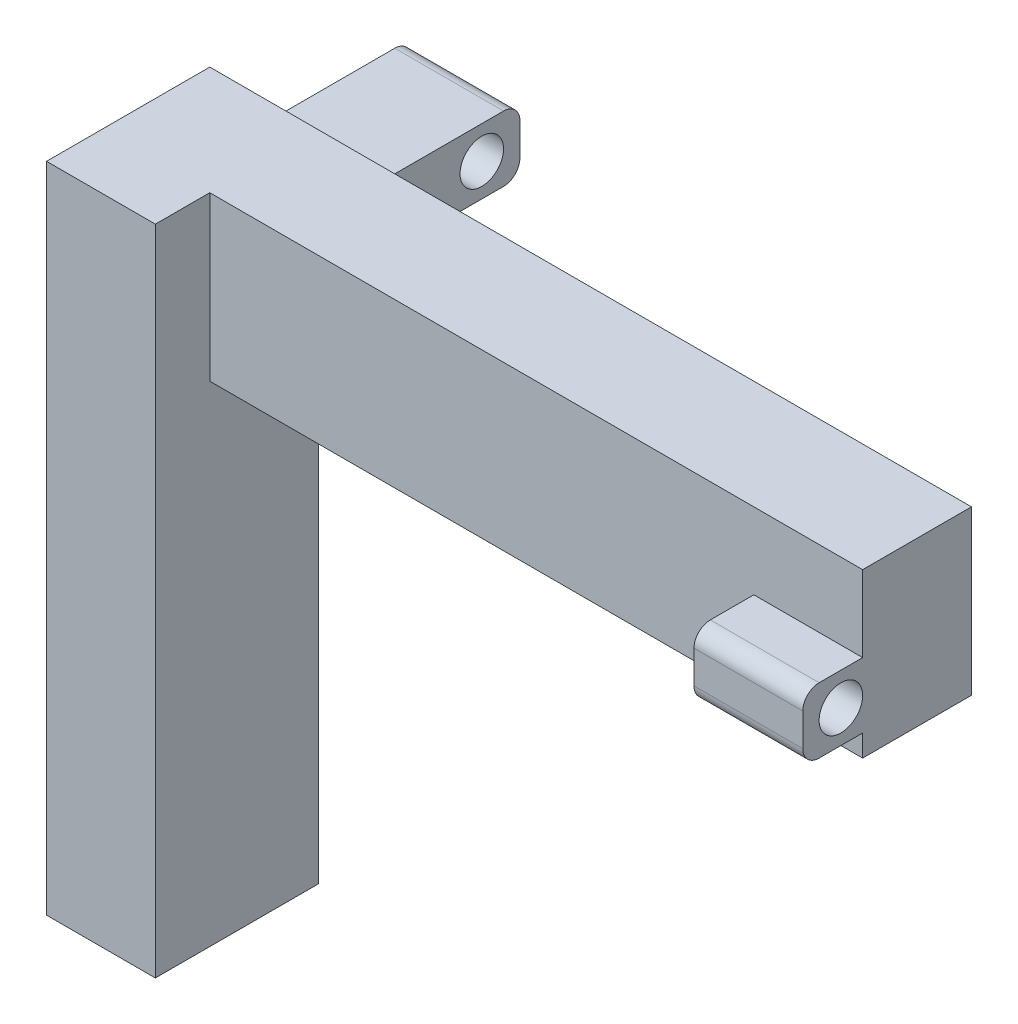
ISO-10303-21;
HEADER;
FILE_DESCRIPTION(('STEP AP214'),'2;1');
FILE_NAME('part.step','',(''),(''),'','','');
FILE_SCHEMA(('AUTOMOTIVE_DESIGN { 1 0 10303 214 1 1 1 1 }'));
ENDSEC;
DATA;
#1=APPLICATION_CONTEXT('core data for automotive mechanical design processes');
#2=APPLICATION_PROTOCOL_DEFINITION('international standard','automotive_design',2000,#1);
#3=PRODUCT_CONTEXT('',#1,'mechanical');
#4=PRODUCT('Part','Part','',(#3));
#5=PRODUCT_RELATED_PRODUCT_CATEGORY('part','',(#4));
#6=PRODUCT_DEFINITION_FORMATION('','',#4);
#7=PRODUCT_DEFINITION_CONTEXT('part definition',#1,'design');
#8=PRODUCT_DEFINITION('design','',#6,#7);
#9=PRODUCT_DEFINITION_SHAPE('','',#8);
#10=(LENGTH_UNIT() NAMED_UNIT(*) SI_UNIT(.MILLI.,.METRE.));
#11=(NAMED_UNIT(*) PLANE_ANGLE_UNIT() SI_UNIT($,.RADIAN.));
#12=(NAMED_UNIT(*) SI_UNIT($,.STERADIAN.) SOLID_ANGLE_UNIT());
#13=UNCERTAINTY_MEASURE_WITH_UNIT(LENGTH_MEASURE(1.E-05),#10,'distance_accuracy_value','');
#14=(GEOMETRIC_REPRESENTATION_CONTEXT(3) GLOBAL_UNCERTAINTY_ASSIGNED_CONTEXT((#13)) GLOBAL_UNIT_ASSIGNED_CONTEXT((#10,
#11,#12)) REPRESENTATION_CONTEXT('',''));
#15=CARTESIAN_POINT('',(0.,0.,0.));
#16=DIRECTION('',(0.,0.,1.));
#17=DIRECTION('',(1.,0.,0.));
#18=AXIS2_PLACEMENT_3D('',#15,#16,#17);
#19=CARTESIAN_POINT('',(0.,0.,0.));
#20=DIRECTION('',(0.,0.,1.));
#21=DIRECTION('',(1.,0.,0.));
#22=AXIS2_PLACEMENT_3D('',#19,#20,#21);
#23=PLANE('',#22);
#24=DIRECTION('',(-1.,0.,0.));
#25=VECTOR('',#24,1.);
#26=CARTESIAN_POINT('',(5.,17.,0.));
#27=LINE('',#26,#25);
#28=CARTESIAN_POINT('',(5.,17.,0.));
#29=VERTEX_POINT('',#28);
#30=CARTESIAN_POINT('',(-5.,17.,0.));
#31=VERTEX_POINT('',#30);
#32=EDGE_CURVE('E211',#29,#31,#27,.T.);
#33=ORIENTED_EDGE('',*,*,#32,.F.);
#34=DIRECTION('',(0.,-1.,0.));
#35=VECTOR('',#34,1.);
#36=CARTESIAN_POINT('',(5.,0.,0.));
#37=LINE('',#36,#35);
#38=CARTESIAN_POINT('',(5.,23.,0.));
#39=VERTEX_POINT('',#38);
#40=EDGE_CURVE('E198',#39,#29,#37,.T.);
#41=ORIENTED_EDGE('',*,*,#40,.F.);
#42=DIRECTION('',(-1.,0.,0.));
#43=VECTOR('',#42,1.);
#44=CARTESIAN_POINT('',(5.,23.,0.));
#45=LINE('',#44,#43);
#46=CARTESIAN_POINT('',(-5.,23.,0.));
#47=VERTEX_POINT('',#46);
#48=EDGE_CURVE('E226',#39,#47,#45,.T.);
#49=ORIENTED_EDGE('',*,*,#48,.T.);
#50=DIRECTION('',(0.,-1.,0.));
#51=VECTOR('',#50,1.);
#52=CARTESIAN_POINT('',(-5.,30.,0.));
#53=LINE('',#52,#51);
#54=CARTESIAN_POINT('',(-5.,30.,0.));
#55=VERTEX_POINT('',#54);
#56=EDGE_CURVE('E323',#55,#47,#53,.T.);
#57=ORIENTED_EDGE('',*,*,#56,.F.);
#58=DIRECTION('',(-1.,0.,0.));
#59=VECTOR('',#58,1.);
#60=CARTESIAN_POINT('',(-5.,30.,0.));
#61=LINE('',#60,#59);
#62=CARTESIAN_POINT('',(65.,30.,0.));
#63=VERTEX_POINT('',#62);
#64=EDGE_CURVE('E320',#63,#55,#61,.T.);
#65=ORIENTED_EDGE('',*,*,#64,.F.);
#66=DIRECTION('',(0.,1.,0.));
#67=VECTOR('',#66,1.);
#68=CARTESIAN_POINT('',(65.,30.,0.));
#69=LINE('',#68,#67);
#70=CARTESIAN_POINT('',(65.,15.,0.));
#71=VERTEX_POINT('',#70);
#72=EDGE_CURVE('E282',#71,#63,#69,.T.);
#73=ORIENTED_EDGE('',*,*,#72,.F.);
#74=DIRECTION('',(-1.,0.,0.));
#75=VECTOR('',#74,1.);
#76=CARTESIAN_POINT('',(65.,15.,0.));
#77=LINE('',#76,#75);
#78=CARTESIAN_POINT('',(5.,15.,0.));
#79=VERTEX_POINT('',#78);
#80=EDGE_CURVE('E294',#71,#79,#77,.T.);
#81=ORIENTED_EDGE('',*,*,#80,.T.);
#82=DIRECTION('',(0.,1.,0.));
#83=VECTOR('',#82,1.);
#84=CARTESIAN_POINT('',(5.,30.,0.));
#85=LINE('',#84,#83);
#86=CARTESIAN_POINT('',(5.00000000000001,-30.,0.));
#87=VERTEX_POINT('',#86);
#88=EDGE_CURVE('E307',#87,#79,#85,.T.);
#89=ORIENTED_EDGE('',*,*,#88,.F.);
#90=DIRECTION('',(1.,0.,0.));
#91=VECTOR('',#90,1.);
#92=CARTESIAN_POINT('',(-4.99999999999999,-30.,0.));
#93=LINE('',#92,#91);
#94=CARTESIAN_POINT('',(-4.99999999999999,-30.,0.));
#95=VERTEX_POINT('',#94);
#96=EDGE_CURVE('E312',#95,#87,#93,.T.);
#97=ORIENTED_EDGE('',*,*,#96,.F.);
#98=EDGE_CURVE('E322',#31,#95,#53,.T.);
#99=ORIENTED_EDGE('',*,*,#98,.F.);
#100=EDGE_LOOP('',(#33,#41,#49,#57,#65,#73,#81,#89,#97,#99));
#101=FACE_BOUND('',#100,.T.);
#102=ADVANCED_FACE('F40',(#101),#23,.F.);
#103=CARTESIAN_POINT('',(65.,30.,10.));
#104=DIRECTION('',(0.,0.,-1.));
#105=DIRECTION('',(-1.,0.,0.));
#106=AXIS2_PLACEMENT_3D('',#103,#104,#105);
#107=PLANE('',#106);
#108=DIRECTION('',(1.,0.,0.));
#109=VECTOR('',#108,1.);
#110=CARTESIAN_POINT('',(55.,23.,10.));
#111=LINE('',#110,#109);
#112=CARTESIAN_POINT('',(55.,23.,10.));
#113=VERTEX_POINT('',#112);
#114=CARTESIAN_POINT('',(65.,23.,10.));
#115=VERTEX_POINT('',#114);
#116=EDGE_CURVE('E275',#113,#115,#111,.T.);
#117=ORIENTED_EDGE('',*,*,#116,.T.);
#118=DIRECTION('',(0.,-1.,0.));
#119=VECTOR('',#118,1.);
#120=CARTESIAN_POINT('',(65.,30.,10.));
#121=LINE('',#120,#119);
#122=CARTESIAN_POINT('',(65.,30.,10.));
#123=VERTEX_POINT('',#122);
#124=EDGE_CURVE('E289',#123,#115,#121,.T.);
#125=ORIENTED_EDGE('',*,*,#124,.F.);
#126=DIRECTION('',(-1.,0.,0.));
#127=VECTOR('',#126,1.);
#128=CARTESIAN_POINT('',(65.,30.,10.));
#129=LINE('',#128,#127);
#130=CARTESIAN_POINT('',(5.,30.,10.));
#131=VERTEX_POINT('',#130);
#132=EDGE_CURVE('E304',#123,#131,#129,.T.);
#133=ORIENTED_EDGE('',*,*,#132,.T.);
#134=DIRECTION('',(0.,-1.,0.));
#135=VECTOR('',#134,1.);
#136=CARTESIAN_POINT('',(5.,30.,10.));
#137=LINE('',#136,#135);
#138=CARTESIAN_POINT('',(5.,15.,10.));
#139=VERTEX_POINT('',#138);
#140=EDGE_CURVE('E270',#131,#139,#137,.T.);
#141=ORIENTED_EDGE('',*,*,#140,.T.);
#142=DIRECTION('',(-1.,0.,0.));
#143=VECTOR('',#142,1.);
#144=CARTESIAN_POINT('',(65.,15.,10.));
#145=LINE('',#144,#143);
#146=CARTESIAN_POINT('',(65.,15.,10.));
#147=VERTEX_POINT('',#146);
#148=EDGE_CURVE('E301',#147,#139,#145,.T.);
#149=ORIENTED_EDGE('',*,*,#148,.F.);
#150=CARTESIAN_POINT('',(65.,17.,10.));
#151=VERTEX_POINT('',#150);
#152=EDGE_CURVE('E288',#151,#147,#121,.T.);
#153=ORIENTED_EDGE('',*,*,#152,.F.);
#154=DIRECTION('',(1.,0.,0.));
#155=VECTOR('',#154,1.);
#156=CARTESIAN_POINT('',(55.,17.,10.));
#157=LINE('',#156,#155);
#158=CARTESIAN_POINT('',(55.,17.,10.));
#159=VERTEX_POINT('',#158);
#160=EDGE_CURVE('E278',#159,#151,#157,.T.);
#161=ORIENTED_EDGE('',*,*,#160,.F.);
#162=DIRECTION('',(0.,1.,0.));
#163=VECTOR('',#162,1.);
#164=CARTESIAN_POINT('',(55.,0.,10.));
#165=LINE('',#164,#163);
#166=CARTESIAN_POINT('',(55.,20.,10.));
#167=VERTEX_POINT('',#166);
#168=EDGE_CURVE('E244',#159,#167,#165,.T.);
#169=ORIENTED_EDGE('',*,*,#168,.T.);
#170=EDGE_CURVE('E243',#167,#113,#165,.T.);
#171=ORIENTED_EDGE('',*,*,#170,.T.);
#172=EDGE_LOOP('',(#117,#125,#133,#141,#149,#153,#161,#169,#171));
#173=FACE_BOUND('',#172,.T.);
#174=ADVANCED_FACE('F361',(#173),#107,.F.);
#175=CARTESIAN_POINT('',(5.,30.,15.));
#176=DIRECTION('',(-1.,0.,0.));
#177=DIRECTION('',(0.,-1.,0.));
#178=AXIS2_PLACEMENT_3D('',#175,#176,#177);
#179=PLANE('',#178);
#180=DIRECTION('',(0.,0.,-1.));
#181=VECTOR('',#180,1.);
#182=CARTESIAN_POINT('',(5.,15.,10.));
#183=LINE('',#182,#181);
#184=EDGE_CURVE('E286',#139,#79,#183,.T.);
#185=ORIENTED_EDGE('',*,*,#184,.F.);
#186=ORIENTED_EDGE('',*,*,#140,.F.);
#187=DIRECTION('',(0.,0.,-1.));
#188=VECTOR('',#187,1.);
#189=CARTESIAN_POINT('',(5.,30.,15.));
#190=LINE('',#189,#188);
#191=CARTESIAN_POINT('',(5.,30.,15.));
#192=VERTEX_POINT('',#191);
#193=EDGE_CURVE('E11',#192,#131,#190,.T.);
#194=ORIENTED_EDGE('',*,*,#193,.F.);
#195=DIRECTION('',(0.,1.,0.));
#196=VECTOR('',#195,1.);
#197=CARTESIAN_POINT('',(5.,30.,15.));
#198=LINE('',#197,#196);
#199=CARTESIAN_POINT('',(5.00000000000001,-30.,15.));
#200=VERTEX_POINT('',#199);
#201=EDGE_CURVE('E308',#200,#192,#198,.T.);
#202=ORIENTED_EDGE('',*,*,#201,.F.);
#203=DIRECTION('',(0.,0.,-1.));
#204=VECTOR('',#203,1.);
#205=CARTESIAN_POINT('',(5.00000000000001,-30.,15.));
#206=LINE('',#205,#204);
#207=EDGE_CURVE('E318',#200,#87,#206,.T.);
#208=ORIENTED_EDGE('',*,*,#207,.T.);
#209=ORIENTED_EDGE('',*,*,#88,.T.);
#210=EDGE_LOOP('',(#185,#186,#194,#202,#208,#209));
#211=FACE_BOUND('',#210,.T.);
#212=ADVANCED_FACE('F42',(#211),#179,.F.);
#213=CARTESIAN_POINT('',(-5.,30.,15.));
#214=DIRECTION('',(0.,-1.,0.));
#215=DIRECTION('',(0.,0.,-1.));
#216=AXIS2_PLACEMENT_3D('',#213,#214,#215);
#217=PLANE('',#216);
#218=ORIENTED_EDGE('',*,*,#64,.T.);
#219=DIRECTION('',(0.,0.,-1.));
#220=VECTOR('',#219,1.);
#221=CARTESIAN_POINT('',(-5.,30.,15.));
#222=LINE('',#221,#220);
#223=CARTESIAN_POINT('',(-5.,30.,15.));
#224=VERTEX_POINT('',#223);
#225=EDGE_CURVE('E48',#224,#55,#222,.T.);
#226=ORIENTED_EDGE('',*,*,#225,.F.);
#227=DIRECTION('',(-1.,0.,0.));
#228=VECTOR('',#227,1.);
#229=CARTESIAN_POINT('',(-5.,30.,15.));
#230=LINE('',#229,#228);
#231=EDGE_CURVE('E311',#192,#224,#230,.T.);
#232=ORIENTED_EDGE('',*,*,#231,.F.);
#233=ORIENTED_EDGE('',*,*,#193,.T.);
#234=ORIENTED_EDGE('',*,*,#132,.F.);
#235=DIRECTION('',(0.,0.,1.));
#236=VECTOR('',#235,1.);
#237=CARTESIAN_POINT('',(65.,30.,0.));
#238=LINE('',#237,#236);
#239=EDGE_CURVE('E285',#63,#123,#238,.T.);
#240=ORIENTED_EDGE('',*,*,#239,.F.);
#241=EDGE_LOOP('',(#218,#226,#232,#233,#234,#240));
#242=FACE_BOUND('',#241,.T.);
#243=ADVANCED_FACE('F376',(#242),#217,.F.);
#244=CARTESIAN_POINT('',(-5.,30.,15.));
#245=DIRECTION('',(1.,0.,0.));
#246=DIRECTION('',(0.,1.,0.));
#247=AXIS2_PLACEMENT_3D('',#244,#245,#246);
#248=PLANE('',#247);
#249=ORIENTED_EDGE('',*,*,#56,.T.);
#250=DIRECTION('',(0.,0.,1.));
#251=VECTOR('',#250,1.);
#252=CARTESIAN_POINT('',(-5.,23.,0.));
#253=LINE('',#252,#251);
#254=CARTESIAN_POINT('',(-5.,23.,-17.));
#255=VERTEX_POINT('',#254);
#256=EDGE_CURVE('E55',#255,#47,#253,.T.);
#257=ORIENTED_EDGE('',*,*,#256,.F.);
#258=CARTESIAN_POINT('',(-5.,21.5,-17.));
#259=DIRECTION('',(1.,0.,0.));
#260=DIRECTION('',(0.,0.,-1.));
#261=AXIS2_PLACEMENT_3D('',#258,#259,#260);
#262=CIRCLE('',#261,1.5);
#263=CARTESIAN_POINT('',(-5.,21.5,-18.5));
#264=VERTEX_POINT('',#263);
#265=EDGE_CURVE('E221',#255,#264,#262,.F.);
#266=ORIENTED_EDGE('',*,*,#265,.T.);
#267=DIRECTION('',(0.,1.,0.));
#268=VECTOR('',#267,1.);
#269=CARTESIAN_POINT('',(-5.,0.,-18.5));
#270=LINE('',#269,#268);
#271=CARTESIAN_POINT('',(-5.,18.5,-18.5));
#272=VERTEX_POINT('',#271);
#273=EDGE_CURVE('E218',#272,#264,#270,.T.);
#274=ORIENTED_EDGE('',*,*,#273,.F.);
#275=CARTESIAN_POINT('',(-5.,18.5,-17.));
#276=DIRECTION('',(1.,0.,0.));
#277=DIRECTION('',(0.,0.,-1.));
#278=AXIS2_PLACEMENT_3D('',#275,#276,#277);
#279=CIRCLE('',#278,1.5);
#280=CARTESIAN_POINT('',(-5.,17.,-17.));
#281=VERTEX_POINT('',#280);
#282=EDGE_CURVE('E216',#281,#272,#279,.T.);
#283=ORIENTED_EDGE('',*,*,#282,.F.);
#284=DIRECTION('',(0.,0.,1.));
#285=VECTOR('',#284,1.);
#286=CARTESIAN_POINT('',(-5.,17.,0.));
#287=LINE('',#286,#285);
#288=EDGE_CURVE('E181',#281,#31,#287,.T.);
#289=ORIENTED_EDGE('',*,*,#288,.T.);
#290=ORIENTED_EDGE('',*,*,#98,.T.);
#291=DIRECTION('',(0.,0.,-1.));
#292=VECTOR('',#291,1.);
#293=CARTESIAN_POINT('',(-4.99999999999999,-30.,15.));
#294=LINE('',#293,#292);
#295=CARTESIAN_POINT('',(-4.99999999999999,-30.,15.));
#296=VERTEX_POINT('',#295);
#297=EDGE_CURVE('E329',#296,#95,#294,.T.);
#298=ORIENTED_EDGE('',*,*,#297,.F.);
#299=DIRECTION('',(0.,-1.,0.));
#300=VECTOR('',#299,1.);
#301=CARTESIAN_POINT('',(-5.,30.,15.));
#302=LINE('',#301,#300);
#303=EDGE_CURVE('E314',#224,#296,#302,.T.);
#304=ORIENTED_EDGE('',*,*,#303,.F.);
#305=ORIENTED_EDGE('',*,*,#225,.T.);
#306=EDGE_LOOP('',(#249,#257,#266,#274,#283,#289,#290,#298,#304,#305));
#307=FACE_BOUND('',#306,.T.);
#308=CARTESIAN_POINT('',(-5.,20.,-15.));
#309=DIRECTION('',(1.,0.,0.));
#310=DIRECTION('',(0.,0.,-1.));
#311=AXIS2_PLACEMENT_3D('',#308,#309,#310);
#312=CIRCLE('',#311,2.);
#313=CARTESIAN_POINT('',(-5.,20.,-17.));
#314=VERTEX_POINT('',#313);
#315=EDGE_CURVE('E212',#314,#314,#312,.T.);
#316=ORIENTED_EDGE('',*,*,#315,.T.);
#317=EDGE_LOOP('',(#316));
#318=FACE_BOUND('',#317,.T.);
#319=ADVANCED_FACE('F336',(#307,#318),#248,.F.);
#320=CARTESIAN_POINT('',(-4.99999999999999,-30.,15.));
#321=DIRECTION('',(0.,1.,0.));
#322=DIRECTION('',(0.,0.,1.));
#323=AXIS2_PLACEMENT_3D('',#320,#321,#322);
#324=PLANE('',#323);
#325=ORIENTED_EDGE('',*,*,#96,.T.);
#326=ORIENTED_EDGE('',*,*,#207,.F.);
#327=DIRECTION('',(1.,0.,0.));
#328=VECTOR('',#327,1.);
#329=CARTESIAN_POINT('',(-4.99999999999999,-30.,15.));
#330=LINE('',#329,#328);
#331=EDGE_CURVE('E316',#296,#200,#330,.T.);
#332=ORIENTED_EDGE('',*,*,#331,.F.);
#333=ORIENTED_EDGE('',*,*,#297,.T.);
#334=EDGE_LOOP('',(#325,#326,#332,#333));
#335=FACE_BOUND('',#334,.T.);
#336=ADVANCED_FACE('F371',(#335),#324,.F.);
#337=CARTESIAN_POINT('',(0.,0.,15.));
#338=DIRECTION('',(0.,0.,1.));
#339=DIRECTION('',(1.,0.,0.));
#340=AXIS2_PLACEMENT_3D('',#337,#338,#339);
#341=PLANE('',#340);
#342=ORIENTED_EDGE('',*,*,#201,.T.);
#343=ORIENTED_EDGE('',*,*,#231,.T.);
#344=ORIENTED_EDGE('',*,*,#303,.T.);
#345=ORIENTED_EDGE('',*,*,#331,.T.);
#346=EDGE_LOOP('',(#342,#343,#344,#345));
#347=FACE_BOUND('',#346,.T.);
#348=ADVANCED_FACE('F370',(#347),#341,.T.);
#349=CARTESIAN_POINT('',(65.,15.,10.));
#350=DIRECTION('',(0.,1.,0.));
#351=DIRECTION('',(0.,0.,1.));
#352=AXIS2_PLACEMENT_3D('',#349,#350,#351);
#353=PLANE('',#352);
#354=ORIENTED_EDGE('',*,*,#184,.T.);
#355=ORIENTED_EDGE('',*,*,#80,.F.);
#356=DIRECTION('',(0.,0.,-1.));
#357=VECTOR('',#356,1.);
#358=CARTESIAN_POINT('',(65.,15.,10.));
#359=LINE('',#358,#357);
#360=EDGE_CURVE('E292',#147,#71,#359,.T.);
#361=ORIENTED_EDGE('',*,*,#360,.F.);
#362=ORIENTED_EDGE('',*,*,#148,.T.);
#363=EDGE_LOOP('',(#354,#355,#361,#362));
#364=FACE_BOUND('',#363,.T.);
#365=ADVANCED_FACE('F391',(#364),#353,.F.);
#366=CARTESIAN_POINT('',(65.,0.,0.));
#367=DIRECTION('',(1.,0.,0.));
#368=DIRECTION('',(0.,0.,-1.));
#369=AXIS2_PLACEMENT_3D('',#366,#367,#368);
#370=PLANE('',#369);
#371=CARTESIAN_POINT('',(65.,20.,12.));
#372=DIRECTION('',(1.,0.,0.));
#373=DIRECTION('',(0.,0.,-1.));
#374=AXIS2_PLACEMENT_3D('',#371,#372,#373);
#375=CIRCLE('',#374,2.);
#376=CARTESIAN_POINT('',(65.,20.,10.));
#377=VERTEX_POINT('',#376);
#378=EDGE_CURVE('E185',#377,#377,#375,.T.);
#379=ORIENTED_EDGE('',*,*,#378,.F.);
#380=EDGE_LOOP('',(#379));
#381=FACE_BOUND('',#380,.T.);
#382=ORIENTED_EDGE('',*,*,#72,.T.);
#383=ORIENTED_EDGE('',*,*,#239,.T.);
#384=ORIENTED_EDGE('',*,*,#124,.T.);
#385=DIRECTION('',(0.,0.,-1.));
#386=VECTOR('',#385,1.);
#387=CARTESIAN_POINT('',(65.,23.,0.));
#388=LINE('',#387,#386);
#389=CARTESIAN_POINT('',(65.,23.,14.));
#390=VERTEX_POINT('',#389);
#391=EDGE_CURVE('E261',#390,#115,#388,.T.);
#392=ORIENTED_EDGE('',*,*,#391,.F.);
#393=CARTESIAN_POINT('',(65.,21.5,14.));
#394=DIRECTION('',(1.,0.,0.));
#395=DIRECTION('',(0.,0.,-1.));
#396=AXIS2_PLACEMENT_3D('',#393,#394,#395);
#397=CIRCLE('',#396,1.5);
#398=CARTESIAN_POINT('',(65.,21.5,15.5));
#399=VERTEX_POINT('',#398);
#400=EDGE_CURVE('E263',#390,#399,#397,.T.);
#401=ORIENTED_EDGE('',*,*,#400,.T.);
#402=DIRECTION('',(0.,-1.,0.));
#403=VECTOR('',#402,1.);
#404=CARTESIAN_POINT('',(65.,0.,15.5));
#405=LINE('',#404,#403);
#406=CARTESIAN_POINT('',(65.,18.5,15.5));
#407=VERTEX_POINT('',#406);
#408=EDGE_CURVE('E240',#399,#407,#405,.T.);
#409=ORIENTED_EDGE('',*,*,#408,.T.);
#410=CARTESIAN_POINT('',(65.,18.5,14.));
#411=DIRECTION('',(1.,0.,0.));
#412=DIRECTION('',(0.,0.,-1.));
#413=AXIS2_PLACEMENT_3D('',#410,#411,#412);
#414=CIRCLE('',#413,1.5);
#415=CARTESIAN_POINT('',(65.,17.,14.));
#416=VERTEX_POINT('',#415);
#417=EDGE_CURVE('E234',#416,#407,#414,.F.);
#418=ORIENTED_EDGE('',*,*,#417,.F.);
#419=DIRECTION('',(0.,0.,-1.));
#420=VECTOR('',#419,1.);
#421=CARTESIAN_POINT('',(65.,17.,0.));
#422=LINE('',#421,#420);
#423=EDGE_CURVE('E259',#416,#151,#422,.T.);
#424=ORIENTED_EDGE('',*,*,#423,.T.);
#425=ORIENTED_EDGE('',*,*,#152,.T.);
#426=ORIENTED_EDGE('',*,*,#360,.T.);
#427=EDGE_LOOP('',(#382,#383,#384,#392,#401,#409,#418,#424,#425,#426));
#428=FACE_BOUND('',#427,.T.);
#429=ADVANCED_FACE('F385',(#381,#428),#370,.T.);
#430=CARTESIAN_POINT('',(55.,18.5,14.));
#431=DIRECTION('',(1.,0.,0.));
#432=DIRECTION('',(0.,0.,-1.));
#433=AXIS2_PLACEMENT_3D('',#430,#431,#432);
#434=CYLINDRICAL_SURFACE('',#433,1.5);
#435=ORIENTED_EDGE('',*,*,#417,.T.);
#436=DIRECTION('',(1.,0.,0.));
#437=VECTOR('',#436,1.);
#438=CARTESIAN_POINT('',(55.,18.5,15.5));
#439=LINE('',#438,#437);
#440=CARTESIAN_POINT('',(55.,18.5,15.5));
#441=VERTEX_POINT('',#440);
#442=EDGE_CURVE('E268',#441,#407,#439,.T.);
#443=ORIENTED_EDGE('',*,*,#442,.F.);
#444=CARTESIAN_POINT('',(55.,18.5,14.));
#445=DIRECTION('',(1.,0.,0.));
#446=DIRECTION('',(0.,0.,-1.));
#447=AXIS2_PLACEMENT_3D('',#444,#445,#446);
#448=CIRCLE('',#447,1.5);
#449=CARTESIAN_POINT('',(55.,17.,14.));
#450=VERTEX_POINT('',#449);
#451=EDGE_CURVE('E237',#450,#441,#448,.F.);
#452=ORIENTED_EDGE('',*,*,#451,.F.);
#453=DIRECTION('',(1.,0.,0.));
#454=VECTOR('',#453,1.);
#455=CARTESIAN_POINT('',(55.,17.,14.));
#456=LINE('',#455,#454);
#457=EDGE_CURVE('E256',#450,#416,#456,.T.);
#458=ORIENTED_EDGE('',*,*,#457,.T.);
#459=EDGE_LOOP('',(#435,#443,#452,#458));
#460=FACE_BOUND('',#459,.T.);
#461=ADVANCED_FACE('F430',(#460),#434,.T.);
#462=CARTESIAN_POINT('',(55.,0.,15.5));
#463=DIRECTION('',(0.,0.,1.));
#464=DIRECTION('',(1.,0.,0.));
#465=AXIS2_PLACEMENT_3D('',#462,#463,#464);
#466=PLANE('',#465);
#467=ORIENTED_EDGE('',*,*,#408,.F.);
#468=DIRECTION('',(1.,0.,0.));
#469=VECTOR('',#468,1.);
#470=CARTESIAN_POINT('',(55.,21.5,15.5));
#471=LINE('',#470,#469);
#472=CARTESIAN_POINT('',(55.,21.5,15.5));
#473=VERTEX_POINT('',#472);
#474=EDGE_CURVE('E271',#473,#399,#471,.T.);
#475=ORIENTED_EDGE('',*,*,#474,.F.);
#476=DIRECTION('',(0.,-1.,0.));
#477=VECTOR('',#476,1.);
#478=CARTESIAN_POINT('',(55.,0.,15.5));
#479=LINE('',#478,#477);
#480=EDGE_CURVE('E253',#473,#441,#479,.T.);
#481=ORIENTED_EDGE('',*,*,#480,.T.);
#482=ORIENTED_EDGE('',*,*,#442,.T.);
#483=EDGE_LOOP('',(#467,#475,#481,#482));
#484=FACE_BOUND('',#483,.T.);
#485=ADVANCED_FACE('F406',(#484),#466,.T.);
#486=CARTESIAN_POINT('',(55.,21.5,14.));
#487=DIRECTION('',(1.,0.,0.));
#488=DIRECTION('',(0.,0.,-1.));
#489=AXIS2_PLACEMENT_3D('',#486,#487,#488);
#490=CYLINDRICAL_SURFACE('',#489,1.5);
#491=ORIENTED_EDGE('',*,*,#400,.F.);
#492=DIRECTION('',(1.,0.,0.));
#493=VECTOR('',#492,1.);
#494=CARTESIAN_POINT('',(55.,23.,14.));
#495=LINE('',#494,#493);
#496=CARTESIAN_POINT('',(55.,23.,14.));
#497=VERTEX_POINT('',#496);
#498=EDGE_CURVE('E273',#497,#390,#495,.T.);
#499=ORIENTED_EDGE('',*,*,#498,.F.);
#500=CARTESIAN_POINT('',(55.,21.5,14.));
#501=DIRECTION('',(1.,0.,0.));
#502=DIRECTION('',(0.,0.,-1.));
#503=AXIS2_PLACEMENT_3D('',#500,#501,#502);
#504=CIRCLE('',#503,1.5);
#505=EDGE_CURVE('E250',#497,#473,#504,.T.);
#506=ORIENTED_EDGE('',*,*,#505,.T.);
#507=ORIENTED_EDGE('',*,*,#474,.T.);
#508=EDGE_LOOP('',(#491,#499,#506,#507));
#509=FACE_BOUND('',#508,.T.);
#510=ADVANCED_FACE('F401',(#509),#490,.T.);
#511=CARTESIAN_POINT('',(55.,23.,0.));
#512=DIRECTION('',(0.,-1.,0.));
#513=DIRECTION('',(0.,0.,-1.));
#514=AXIS2_PLACEMENT_3D('',#511,#512,#513);
#515=PLANE('',#514);
#516=ORIENTED_EDGE('',*,*,#391,.T.);
#517=ORIENTED_EDGE('',*,*,#116,.F.);
#518=DIRECTION('',(0.,0.,-1.));
#519=VECTOR('',#518,1.);
#520=CARTESIAN_POINT('',(55.,23.,0.));
#521=LINE('',#520,#519);
#522=EDGE_CURVE('E247',#497,#113,#521,.T.);
#523=ORIENTED_EDGE('',*,*,#522,.F.);
#524=ORIENTED_EDGE('',*,*,#498,.T.);
#525=EDGE_LOOP('',(#516,#517,#523,#524));
#526=FACE_BOUND('',#525,.T.);
#527=ADVANCED_FACE('F419',(#526),#515,.F.);
#528=CARTESIAN_POINT('',(55.,17.,0.));
#529=DIRECTION('',(0.,-1.,0.));
#530=DIRECTION('',(0.,0.,-1.));
#531=AXIS2_PLACEMENT_3D('',#528,#529,#530);
#532=PLANE('',#531);
#533=ORIENTED_EDGE('',*,*,#423,.F.);
#534=ORIENTED_EDGE('',*,*,#457,.F.);
#535=DIRECTION('',(0.,0.,-1.));
#536=VECTOR('',#535,1.);
#537=CARTESIAN_POINT('',(55.,17.,0.));
#538=LINE('',#537,#536);
#539=EDGE_CURVE('E239',#450,#159,#538,.T.);
#540=ORIENTED_EDGE('',*,*,#539,.T.);
#541=ORIENTED_EDGE('',*,*,#160,.T.);
#542=EDGE_LOOP('',(#533,#534,#540,#541));
#543=FACE_BOUND('',#542,.T.);
#544=ADVANCED_FACE('F412',(#543),#532,.T.);
#545=CARTESIAN_POINT('',(55.,0.,0.));
#546=DIRECTION('',(1.,0.,0.));
#547=DIRECTION('',(0.,0.,-1.));
#548=AXIS2_PLACEMENT_3D('',#545,#546,#547);
#549=PLANE('',#548);
#550=ORIENTED_EDGE('',*,*,#170,.F.);
#551=CARTESIAN_POINT('',(55.,20.,12.));
#552=DIRECTION('',(1.,0.,0.));
#553=DIRECTION('',(0.,0.,-1.));
#554=AXIS2_PLACEMENT_3D('',#551,#552,#553);
#555=CIRCLE('',#554,2.);
#556=EDGE_CURVE('E61',#167,#167,#555,.T.);
#557=ORIENTED_EDGE('',*,*,#556,.T.);
#558=ORIENTED_EDGE('',*,*,#168,.F.);
#559=ORIENTED_EDGE('',*,*,#539,.F.);
#560=ORIENTED_EDGE('',*,*,#451,.T.);
#561=ORIENTED_EDGE('',*,*,#480,.F.);
#562=ORIENTED_EDGE('',*,*,#505,.F.);
#563=ORIENTED_EDGE('',*,*,#522,.T.);
#564=EDGE_LOOP('',(#550,#557,#558,#559,#560,#561,#562,#563));
#565=FACE_BOUND('',#564,.T.);
#566=ADVANCED_FACE('F418',(#565),#549,.F.);
#567=CARTESIAN_POINT('',(55.,20.,12.));
#568=DIRECTION('',(1.,0.,0.));
#569=DIRECTION('',(0.,0.,-1.));
#570=AXIS2_PLACEMENT_3D('',#567,#568,#569);
#571=CYLINDRICAL_SURFACE('',#570,2.);
#572=ORIENTED_EDGE('',*,*,#556,.F.);
#573=EDGE_LOOP('',(#572));
#574=FACE_BOUND('',#573,.T.);
#575=ORIENTED_EDGE('',*,*,#378,.T.);
#576=EDGE_LOOP('',(#575));
#577=FACE_BOUND('',#576,.T.);
#578=ADVANCED_FACE('F470',(#574,#577),#571,.F.);
#579=CARTESIAN_POINT('',(5.,17.,0.));
#580=DIRECTION('',(0.,-1.,0.));
#581=DIRECTION('',(0.,0.,-1.));
#582=AXIS2_PLACEMENT_3D('',#579,#580,#581);
#583=PLANE('',#582);
#584=ORIENTED_EDGE('',*,*,#288,.F.);
#585=DIRECTION('',(-1.,0.,0.));
#586=VECTOR('',#585,1.);
#587=CARTESIAN_POINT('',(5.,17.,-17.));
#588=LINE('',#587,#586);
#589=CARTESIAN_POINT('',(5.,17.,-17.));
#590=VERTEX_POINT('',#589);
#591=EDGE_CURVE('E174',#590,#281,#588,.T.);
#592=ORIENTED_EDGE('',*,*,#591,.F.);
#593=DIRECTION('',(0.,0.,1.));
#594=VECTOR('',#593,1.);
#595=CARTESIAN_POINT('',(5.,17.,0.));
#596=LINE('',#595,#594);
#597=EDGE_CURVE('E178',#590,#29,#596,.T.);
#598=ORIENTED_EDGE('',*,*,#597,.T.);
#599=ORIENTED_EDGE('',*,*,#32,.T.);
#600=EDGE_LOOP('',(#584,#592,#598,#599));
#601=FACE_BOUND('',#600,.T.);
#602=ADVANCED_FACE('F176',(#601),#583,.T.);
#603=CARTESIAN_POINT('',(5.,18.5,-17.));
#604=DIRECTION('',(-1.,0.,0.));
#605=DIRECTION('',(0.,0.,1.));
#606=AXIS2_PLACEMENT_3D('',#603,#604,#605);
#607=CYLINDRICAL_SURFACE('',#606,1.5);
#608=ORIENTED_EDGE('',*,*,#282,.T.);
#609=DIRECTION('',(-1.,0.,0.));
#610=VECTOR('',#609,1.);
#611=CARTESIAN_POINT('',(5.,18.5,-18.5));
#612=LINE('',#611,#610);
#613=CARTESIAN_POINT('',(5.,18.5,-18.5));
#614=VERTEX_POINT('',#613);
#615=EDGE_CURVE('E186',#614,#272,#612,.T.);
#616=ORIENTED_EDGE('',*,*,#615,.F.);
#617=CARTESIAN_POINT('',(5.,18.5,-17.));
#618=DIRECTION('',(1.,0.,0.));
#619=DIRECTION('',(0.,0.,-1.));
#620=AXIS2_PLACEMENT_3D('',#617,#618,#619);
#621=CIRCLE('',#620,1.5);
#622=EDGE_CURVE('E190',#590,#614,#621,.T.);
#623=ORIENTED_EDGE('',*,*,#622,.F.);
#624=ORIENTED_EDGE('',*,*,#591,.T.);
#625=EDGE_LOOP('',(#608,#616,#623,#624));
#626=FACE_BOUND('',#625,.T.);
#627=ADVANCED_FACE('F191',(#626),#607,.T.);
#628=CARTESIAN_POINT('',(5.,0.,-18.5));
#629=DIRECTION('',(0.,0.,1.));
#630=DIRECTION('',(1.,0.,0.));
#631=AXIS2_PLACEMENT_3D('',#628,#629,#630);
#632=PLANE('',#631);
#633=ORIENTED_EDGE('',*,*,#273,.T.);
#634=DIRECTION('',(-1.,0.,0.));
#635=VECTOR('',#634,1.);
#636=CARTESIAN_POINT('',(5.,21.5,-18.5));
#637=LINE('',#636,#635);
#638=CARTESIAN_POINT('',(5.,21.5,-18.5));
#639=VERTEX_POINT('',#638);
#640=EDGE_CURVE('E230',#639,#264,#637,.T.);
#641=ORIENTED_EDGE('',*,*,#640,.F.);
#642=DIRECTION('',(0.,1.,0.));
#643=VECTOR('',#642,1.);
#644=CARTESIAN_POINT('',(5.,0.,-18.5));
#645=LINE('',#644,#643);
#646=EDGE_CURVE('E194',#614,#639,#645,.T.);
#647=ORIENTED_EDGE('',*,*,#646,.F.);
#648=ORIENTED_EDGE('',*,*,#615,.T.);
#649=EDGE_LOOP('',(#633,#641,#647,#648));
#650=FACE_BOUND('',#649,.T.);
#651=ADVANCED_FACE('F351',(#650),#632,.F.);
#652=CARTESIAN_POINT('',(5.,21.5,-17.));
#653=DIRECTION('',(-1.,0.,0.));
#654=DIRECTION('',(0.,0.,1.));
#655=AXIS2_PLACEMENT_3D('',#652,#653,#654);
#656=CYLINDRICAL_SURFACE('',#655,1.5);
#657=ORIENTED_EDGE('',*,*,#265,.F.);
#658=DIRECTION('',(-1.,0.,0.));
#659=VECTOR('',#658,1.);
#660=CARTESIAN_POINT('',(5.,23.,-17.));
#661=LINE('',#660,#659);
#662=CARTESIAN_POINT('',(5.,23.,-17.));
#663=VERTEX_POINT('',#662);
#664=EDGE_CURVE('E228',#663,#255,#661,.T.);
#665=ORIENTED_EDGE('',*,*,#664,.F.);
#666=CARTESIAN_POINT('',(5.,21.5,-17.));
#667=DIRECTION('',(1.,0.,0.));
#668=DIRECTION('',(0.,0.,-1.));
#669=AXIS2_PLACEMENT_3D('',#666,#667,#668);
#670=CIRCLE('',#669,1.5);
#671=EDGE_CURVE('E205',#663,#639,#670,.F.);
#672=ORIENTED_EDGE('',*,*,#671,.T.);
#673=ORIENTED_EDGE('',*,*,#640,.T.);
#674=EDGE_LOOP('',(#657,#665,#672,#673));
#675=FACE_BOUND('',#674,.T.);
#676=ADVANCED_FACE('F349',(#675),#656,.T.);
#677=CARTESIAN_POINT('',(5.,23.,0.));
#678=DIRECTION('',(0.,-1.,0.));
#679=DIRECTION('',(0.,0.,-1.));
#680=AXIS2_PLACEMENT_3D('',#677,#678,#679);
#681=PLANE('',#680);
#682=ORIENTED_EDGE('',*,*,#256,.T.);
#683=ORIENTED_EDGE('',*,*,#48,.F.);
#684=DIRECTION('',(0.,0.,1.));
#685=VECTOR('',#684,1.);
#686=CARTESIAN_POINT('',(5.,23.,0.));
#687=LINE('',#686,#685);
#688=EDGE_CURVE('E208',#663,#39,#687,.T.);
#689=ORIENTED_EDGE('',*,*,#688,.F.);
#690=ORIENTED_EDGE('',*,*,#664,.T.);
#691=EDGE_LOOP('',(#682,#683,#689,#690));
#692=FACE_BOUND('',#691,.T.);
#693=ADVANCED_FACE('F344',(#692),#681,.F.);
#694=CARTESIAN_POINT('',(5.,20.,-15.));
#695=DIRECTION('',(-1.,0.,0.));
#696=DIRECTION('',(0.,0.,1.));
#697=AXIS2_PLACEMENT_3D('',#694,#695,#696);
#698=CYLINDRICAL_SURFACE('',#697,2.);
#699=CARTESIAN_POINT('',(5.,20.,-15.));
#700=DIRECTION('',(1.,0.,0.));
#701=DIRECTION('',(0.,0.,-1.));
#702=AXIS2_PLACEMENT_3D('',#699,#700,#701);
#703=CIRCLE('',#702,2.);
#704=CARTESIAN_POINT('',(5.,20.,-17.));
#705=VERTEX_POINT('',#704);
#706=EDGE_CURVE('E199',#705,#705,#703,.T.);
#707=ORIENTED_EDGE('',*,*,#706,.T.);
#708=EDGE_LOOP('',(#707));
#709=FACE_BOUND('',#708,.T.);
#710=ORIENTED_EDGE('',*,*,#315,.F.);
#711=EDGE_LOOP('',(#710));
#712=FACE_BOUND('',#711,.T.);
#713=ADVANCED_FACE('F497',(#709,#712),#698,.F.);
#714=CARTESIAN_POINT('',(5.,0.,0.));
#715=DIRECTION('',(1.,0.,0.));
#716=DIRECTION('',(0.,0.,-1.));
#717=AXIS2_PLACEMENT_3D('',#714,#715,#716);
#718=PLANE('',#717);
#719=ORIENTED_EDGE('',*,*,#706,.F.);
#720=EDGE_LOOP('',(#719));
#721=FACE_BOUND('',#720,.T.);
#722=ORIENTED_EDGE('',*,*,#597,.F.);
#723=ORIENTED_EDGE('',*,*,#622,.T.);
#724=ORIENTED_EDGE('',*,*,#646,.T.);
#725=ORIENTED_EDGE('',*,*,#671,.F.);
#726=ORIENTED_EDGE('',*,*,#688,.T.);
#727=ORIENTED_EDGE('',*,*,#40,.T.);
#728=EDGE_LOOP('',(#722,#723,#724,#725,#726,#727));
#729=FACE_BOUND('',#728,.T.);
#730=ADVANCED_FACE('F196',(#721,#729),#718,.T.);
#731=CLOSED_SHELL('',(#102,#174,#212,#243,#319,#336,#348,#365,#429,#461,#485,#510,#527,#544,
#566,#578,#602,#627,#651,#676,#693,#713,#730));
#732=MANIFOLD_SOLID_BREP('B2',#731);
#733=ADVANCED_BREP_SHAPE_REPRESENTATION('',(#18,#732),#14);
#734=SHAPE_DEFINITION_REPRESENTATION(#9,#733);
ENDSEC;
END-ISO-10303-21;
